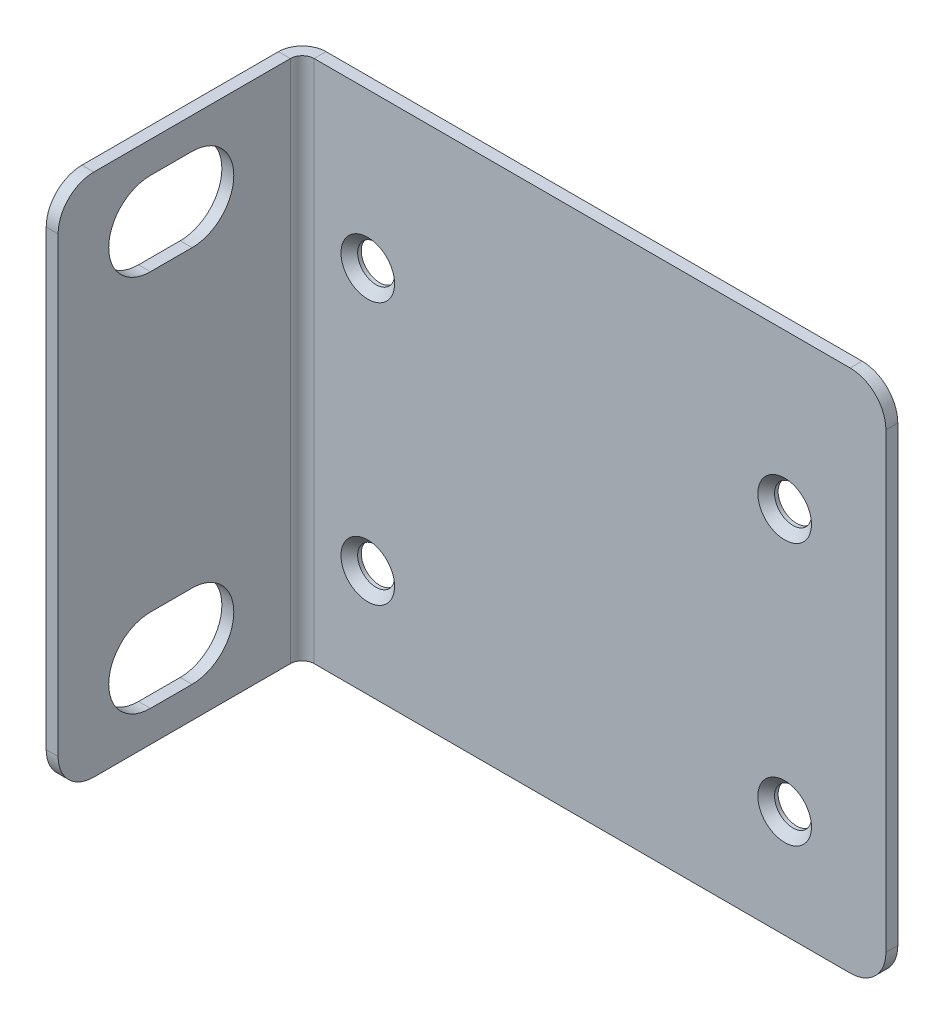
ISO-10303-21;
HEADER;
FILE_DESCRIPTION(('STEP AP214'),'2;1');
FILE_NAME('part.step','',(''),(''),'','','');
FILE_SCHEMA(('AUTOMOTIVE_DESIGN { 1 0 10303 214 1 1 1 1 }'));
ENDSEC;
DATA;
#1=APPLICATION_CONTEXT('core data for automotive mechanical design processes');
#2=APPLICATION_PROTOCOL_DEFINITION('international standard','automotive_design',2000,#1);
#3=PRODUCT_CONTEXT('',#1,'mechanical');
#4=PRODUCT('Part','Part','',(#3));
#5=PRODUCT_RELATED_PRODUCT_CATEGORY('part','',(#4));
#6=PRODUCT_DEFINITION_FORMATION('','',#4);
#7=PRODUCT_DEFINITION_CONTEXT('part definition',#1,'design');
#8=PRODUCT_DEFINITION('design','',#6,#7);
#9=PRODUCT_DEFINITION_SHAPE('','',#8);
#10=(LENGTH_UNIT() NAMED_UNIT(*) SI_UNIT(.MILLI.,.METRE.));
#11=(NAMED_UNIT(*) PLANE_ANGLE_UNIT() SI_UNIT($,.RADIAN.));
#12=(NAMED_UNIT(*) SI_UNIT($,.STERADIAN.) SOLID_ANGLE_UNIT());
#13=UNCERTAINTY_MEASURE_WITH_UNIT(LENGTH_MEASURE(1.E-05),#10,'distance_accuracy_value','');
#14=(GEOMETRIC_REPRESENTATION_CONTEXT(3) GLOBAL_UNCERTAINTY_ASSIGNED_CONTEXT((#13)) GLOBAL_UNIT_ASSIGNED_CONTEXT((#10,
#11,#12)) REPRESENTATION_CONTEXT('',''));
#15=CARTESIAN_POINT('',(0.,0.,0.));
#16=DIRECTION('',(0.,0.,1.));
#17=DIRECTION('',(1.,0.,0.));
#18=AXIS2_PLACEMENT_3D('',#15,#16,#17);
#19=CARTESIAN_POINT('',(2.,22.,0.));
#20=DIRECTION('',(0.,1.,0.));
#21=DIRECTION('',(0.,0.,1.));
#22=AXIS2_PLACEMENT_3D('',#19,#20,#21);
#23=PLANE('',#22);
#24=DIRECTION('',(0.,0.,1.));
#25=VECTOR('',#24,1.);
#26=CARTESIAN_POINT('',(2.,22.,0.));
#27=LINE('',#26,#25);
#28=CARTESIAN_POINT('',(2.,22.,0.));
#29=VERTEX_POINT('',#28);
#30=CARTESIAN_POINT('',(2.,22.,1.));
#31=VERTEX_POINT('',#30);
#32=EDGE_CURVE('E446',#29,#31,#27,.T.);
#33=ORIENTED_EDGE('',*,*,#32,.F.);
#34=CARTESIAN_POINT('',(2.,22.,2.));
#35=DIRECTION('',(0.,1.,0.));
#36=DIRECTION('',(0.,0.,1.));
#37=AXIS2_PLACEMENT_3D('',#34,#35,#36);
#38=CIRCLE('',#37,2.);
#39=CARTESIAN_POINT('',(0.,22.,2.));
#40=VERTEX_POINT('',#39);
#41=EDGE_CURVE('E390',#40,#29,#38,.F.);
#42=ORIENTED_EDGE('',*,*,#41,.F.);
#43=DIRECTION('',(-1.,0.,0.));
#44=VECTOR('',#43,1.);
#45=CARTESIAN_POINT('',(1.,22.,2.));
#46=LINE('',#45,#44);
#47=CARTESIAN_POINT('',(1.,22.,2.));
#48=VERTEX_POINT('',#47);
#49=EDGE_CURVE('E443',#48,#40,#46,.T.);
#50=ORIENTED_EDGE('',*,*,#49,.F.);
#51=CARTESIAN_POINT('',(2.,22.,2.));
#52=DIRECTION('',(0.,1.,0.));
#53=DIRECTION('',(1.,0.,0.));
#54=AXIS2_PLACEMENT_3D('',#51,#52,#53);
#55=CIRCLE('',#54,1.);
#56=EDGE_CURVE('E397',#48,#31,#55,.F.);
#57=ORIENTED_EDGE('',*,*,#56,.T.);
#58=EDGE_LOOP('',(#33,#42,#50,#57));
#59=FACE_BOUND('',#58,.T.);
#60=ADVANCED_FACE('F188',(#59),#23,.T.);
#61=CARTESIAN_POINT('',(1.,22.,2.));
#62=DIRECTION('',(0.,1.,0.));
#63=DIRECTION('',(0.,0.,1.));
#64=AXIS2_PLACEMENT_3D('',#61,#62,#63);
#65=PLANE('',#64);
#66=DIRECTION('',(1.,0.,0.));
#67=VECTOR('',#66,1.);
#68=CARTESIAN_POINT('',(0.,22.,1.));
#69=LINE('',#68,#67);
#70=CARTESIAN_POINT('',(47.,22.,1.));
#71=VERTEX_POINT('',#70);
#72=EDGE_CURVE('E383',#31,#71,#69,.T.);
#73=ORIENTED_EDGE('',*,*,#72,.T.);
#74=DIRECTION('',(0.,0.,1.));
#75=VECTOR('',#74,1.);
#76=CARTESIAN_POINT('',(47.,22.,2.));
#77=LINE('',#76,#75);
#78=CARTESIAN_POINT('',(47.,22.,0.));
#79=VERTEX_POINT('',#78);
#80=EDGE_CURVE('E457',#71,#79,#77,.F.);
#81=ORIENTED_EDGE('',*,*,#80,.T.);
#82=DIRECTION('',(1.,0.,0.));
#83=VECTOR('',#82,1.);
#84=CARTESIAN_POINT('',(0.,22.,0.));
#85=LINE('',#84,#83);
#86=EDGE_CURVE('E386',#29,#79,#85,.T.);
#87=ORIENTED_EDGE('',*,*,#86,.F.);
#88=ORIENTED_EDGE('',*,*,#32,.T.);
#89=EDGE_LOOP('',(#73,#81,#87,#88));
#90=FACE_BOUND('',#89,.T.);
#91=ADVANCED_FACE('F523',(#90),#65,.T.);
#92=CARTESIAN_POINT('',(0.,-22.,2.));
#93=DIRECTION('',(0.,-1.,0.));
#94=DIRECTION('',(0.,0.,-1.));
#95=AXIS2_PLACEMENT_3D('',#92,#93,#94);
#96=PLANE('',#95);
#97=DIRECTION('',(1.,0.,0.));
#98=VECTOR('',#97,1.);
#99=CARTESIAN_POINT('',(0.,-22.,2.));
#100=LINE('',#99,#98);
#101=CARTESIAN_POINT('',(0.,-22.,2.));
#102=VERTEX_POINT('',#101);
#103=CARTESIAN_POINT('',(1.,-22.,2.));
#104=VERTEX_POINT('',#103);
#105=EDGE_CURVE('E440',#102,#104,#100,.T.);
#106=ORIENTED_EDGE('',*,*,#105,.F.);
#107=CARTESIAN_POINT('',(2.,-22.,2.));
#108=DIRECTION('',(0.,1.,0.));
#109=DIRECTION('',(0.,0.,1.));
#110=AXIS2_PLACEMENT_3D('',#107,#108,#109);
#111=CIRCLE('',#110,2.);
#112=CARTESIAN_POINT('',(2.,-22.,0.));
#113=VERTEX_POINT('',#112);
#114=EDGE_CURVE('E406',#102,#113,#111,.F.);
#115=ORIENTED_EDGE('',*,*,#114,.T.);
#116=DIRECTION('',(0.,0.,-1.));
#117=VECTOR('',#116,1.);
#118=CARTESIAN_POINT('',(2.,-22.,1.));
#119=LINE('',#118,#117);
#120=CARTESIAN_POINT('',(2.,-22.,1.));
#121=VERTEX_POINT('',#120);
#122=EDGE_CURVE('E438',#121,#113,#119,.T.);
#123=ORIENTED_EDGE('',*,*,#122,.F.);
#124=CARTESIAN_POINT('',(2.,-22.,2.));
#125=DIRECTION('',(0.,1.,0.));
#126=DIRECTION('',(1.,0.,0.));
#127=AXIS2_PLACEMENT_3D('',#124,#125,#126);
#128=CIRCLE('',#127,1.);
#129=EDGE_CURVE('E387',#104,#121,#128,.F.);
#130=ORIENTED_EDGE('',*,*,#129,.F.);
#131=EDGE_LOOP('',(#106,#115,#123,#130));
#132=FACE_BOUND('',#131,.T.);
#133=ADVANCED_FACE('F529',(#132),#96,.T.);
#134=CARTESIAN_POINT('',(2.,-22.,1.));
#135=DIRECTION('',(0.,-1.,0.));
#136=DIRECTION('',(0.,0.,-1.));
#137=AXIS2_PLACEMENT_3D('',#134,#135,#136);
#138=PLANE('',#137);
#139=DIRECTION('',(0.,0.,-1.));
#140=VECTOR('',#139,1.);
#141=CARTESIAN_POINT('',(1.,-22.,21.5));
#142=LINE('',#141,#140);
#143=CARTESIAN_POINT('',(1.,-22.,18.5));
#144=VERTEX_POINT('',#143);
#145=EDGE_CURVE('E411',#144,#104,#142,.T.);
#146=ORIENTED_EDGE('',*,*,#145,.F.);
#147=DIRECTION('',(-1.,0.,0.));
#148=VECTOR('',#147,1.);
#149=CARTESIAN_POINT('',(2.,-22.,18.5));
#150=LINE('',#149,#148);
#151=CARTESIAN_POINT('',(0.,-22.,18.5));
#152=VERTEX_POINT('',#151);
#153=EDGE_CURVE('E466',#144,#152,#150,.T.);
#154=ORIENTED_EDGE('',*,*,#153,.T.);
#155=DIRECTION('',(0.,0.,-1.));
#156=VECTOR('',#155,1.);
#157=CARTESIAN_POINT('',(0.,-22.,21.5));
#158=LINE('',#157,#156);
#159=EDGE_CURVE('E409',#152,#102,#158,.T.);
#160=ORIENTED_EDGE('',*,*,#159,.T.);
#161=ORIENTED_EDGE('',*,*,#105,.T.);
#162=EDGE_LOOP('',(#146,#154,#160,#161));
#163=FACE_BOUND('',#162,.T.);
#164=ADVANCED_FACE('F556',(#163),#138,.T.);
#165=CARTESIAN_POINT('',(0.,22.,1.));
#166=DIRECTION('',(0.,0.,-1.));
#167=DIRECTION('',(-1.,0.,0.));
#168=AXIS2_PLACEMENT_3D('',#165,#166,#167);
#169=PLANE('',#168);
#170=CARTESIAN_POINT('',(6.49999999999972,9.00000000000059,1.));
#171=DIRECTION('',(0.,0.,1.));
#172=DIRECTION('',(1.,0.,0.));
#173=AXIS2_PLACEMENT_3D('',#170,#171,#172);
#174=CIRCLE('',#173,2.25);
#175=CARTESIAN_POINT('',(8.74999999999972,9.00000000000059,1.));
#176=VERTEX_POINT('',#175);
#177=EDGE_CURVE('E909',#176,#176,#174,.T.);
#178=ORIENTED_EDGE('',*,*,#177,.F.);
#179=EDGE_LOOP('',(#178));
#180=FACE_BOUND('',#179,.T.);
#181=CARTESIAN_POINT('',(41.4999999999997,-12.9999999999994,1.));
#182=DIRECTION('',(0.,0.,1.));
#183=DIRECTION('',(1.,0.,0.));
#184=AXIS2_PLACEMENT_3D('',#181,#182,#183);
#185=CIRCLE('',#184,2.25);
#186=CARTESIAN_POINT('',(43.7499999999997,-12.9999999999994,1.));
#187=VERTEX_POINT('',#186);
#188=EDGE_CURVE('E916',#187,#187,#185,.T.);
#189=ORIENTED_EDGE('',*,*,#188,.F.);
#190=EDGE_LOOP('',(#189));
#191=FACE_BOUND('',#190,.T.);
#192=CARTESIAN_POINT('',(6.49999999999974,-12.9999999999994,1.));
#193=DIRECTION('',(0.,0.,1.));
#194=DIRECTION('',(1.,0.,0.));
#195=AXIS2_PLACEMENT_3D('',#192,#193,#194);
#196=CIRCLE('',#195,2.25);
#197=CARTESIAN_POINT('',(8.74999999999974,-12.9999999999994,1.));
#198=VERTEX_POINT('',#197);
#199=EDGE_CURVE('E925',#198,#198,#196,.T.);
#200=ORIENTED_EDGE('',*,*,#199,.F.);
#201=EDGE_LOOP('',(#200));
#202=FACE_BOUND('',#201,.T.);
#203=CARTESIAN_POINT('',(41.4999999999997,9.00000000000058,1.));
#204=DIRECTION('',(0.,0.,1.));
#205=DIRECTION('',(1.,0.,0.));
#206=AXIS2_PLACEMENT_3D('',#203,#204,#205);
#207=CIRCLE('',#206,2.25);
#208=CARTESIAN_POINT('',(43.7499999999997,9.00000000000058,1.));
#209=VERTEX_POINT('',#208);
#210=EDGE_CURVE('E934',#209,#209,#207,.T.);
#211=ORIENTED_EDGE('',*,*,#210,.F.);
#212=EDGE_LOOP('',(#211));
#213=FACE_BOUND('',#212,.T.);
#214=DIRECTION('',(0.,-1.,0.));
#215=VECTOR('',#214,1.);
#216=CARTESIAN_POINT('',(50.,22.,1.));
#217=LINE('',#216,#215);
#218=CARTESIAN_POINT('',(50.,19.,1.));
#219=VERTEX_POINT('',#218);
#220=CARTESIAN_POINT('',(50.,-19.,1.));
#221=VERTEX_POINT('',#220);
#222=EDGE_CURVE('E435',#219,#221,#217,.T.);
#223=ORIENTED_EDGE('',*,*,#222,.F.);
#224=CARTESIAN_POINT('',(47.,19.,1.));
#225=DIRECTION('',(0.,0.,-1.));
#226=DIRECTION('',(-1.,0.,0.));
#227=AXIS2_PLACEMENT_3D('',#224,#225,#226);
#228=CIRCLE('',#227,3.);
#229=EDGE_CURVE('E455',#219,#71,#228,.F.);
#230=ORIENTED_EDGE('',*,*,#229,.T.);
#231=ORIENTED_EDGE('',*,*,#72,.F.);
#232=DIRECTION('',(0.,-1.,0.));
#233=VECTOR('',#232,1.);
#234=CARTESIAN_POINT('',(2.,22.,1.));
#235=LINE('',#234,#233);
#236=EDGE_CURVE('E400',#31,#121,#235,.T.);
#237=ORIENTED_EDGE('',*,*,#236,.T.);
#238=DIRECTION('',(1.,0.,0.));
#239=VECTOR('',#238,1.);
#240=CARTESIAN_POINT('',(0.,-22.,1.));
#241=LINE('',#240,#239);
#242=CARTESIAN_POINT('',(47.,-22.,1.));
#243=VERTEX_POINT('',#242);
#244=EDGE_CURVE('E382',#121,#243,#241,.T.);
#245=ORIENTED_EDGE('',*,*,#244,.T.);
#246=CARTESIAN_POINT('',(47.,-19.,1.));
#247=DIRECTION('',(0.,0.,-1.));
#248=DIRECTION('',(-1.,0.,0.));
#249=AXIS2_PLACEMENT_3D('',#246,#247,#248);
#250=CIRCLE('',#249,3.);
#251=EDGE_CURVE('E453',#243,#221,#250,.F.);
#252=ORIENTED_EDGE('',*,*,#251,.T.);
#253=EDGE_LOOP('',(#223,#230,#231,#237,#245,#252));
#254=FACE_BOUND('',#253,.T.);
#255=ADVANCED_FACE('F584',(#180,#191,#202,#213,#254),#169,.F.);
#256=CARTESIAN_POINT('',(50.,22.,0.));
#257=DIRECTION('',(1.,0.,0.));
#258=DIRECTION('',(0.,0.,-1.));
#259=AXIS2_PLACEMENT_3D('',#256,#257,#258);
#260=PLANE('',#259);
#261=DIRECTION('',(0.,-1.,0.));
#262=VECTOR('',#261,1.);
#263=CARTESIAN_POINT('',(50.,22.,0.));
#264=LINE('',#263,#262);
#265=CARTESIAN_POINT('',(50.,19.,0.));
#266=VERTEX_POINT('',#265);
#267=CARTESIAN_POINT('',(50.,-19.,0.));
#268=VERTEX_POINT('',#267);
#269=EDGE_CURVE('E432',#266,#268,#264,.T.);
#270=ORIENTED_EDGE('',*,*,#269,.F.);
#271=DIRECTION('',(0.,0.,1.));
#272=VECTOR('',#271,1.);
#273=CARTESIAN_POINT('',(50.,19.,0.));
#274=LINE('',#273,#272);
#275=EDGE_CURVE('E450',#266,#219,#274,.T.);
#276=ORIENTED_EDGE('',*,*,#275,.T.);
#277=ORIENTED_EDGE('',*,*,#222,.T.);
#278=DIRECTION('',(0.,0.,1.));
#279=VECTOR('',#278,1.);
#280=CARTESIAN_POINT('',(50.,-19.,0.));
#281=LINE('',#280,#279);
#282=EDGE_CURVE('E448',#221,#268,#281,.F.);
#283=ORIENTED_EDGE('',*,*,#282,.T.);
#284=EDGE_LOOP('',(#270,#276,#277,#283));
#285=FACE_BOUND('',#284,.T.);
#286=ADVANCED_FACE('F590',(#285),#260,.T.);
#287=CARTESIAN_POINT('',(0.,22.,0.));
#288=DIRECTION('',(0.,0.,-1.));
#289=DIRECTION('',(-1.,0.,0.));
#290=AXIS2_PLACEMENT_3D('',#287,#288,#289);
#291=PLANE('',#290);
#292=CARTESIAN_POINT('',(6.49999999999972,9.00000000000059,0.));
#293=DIRECTION('',(0.,0.,1.));
#294=DIRECTION('',(1.,0.,0.));
#295=AXIS2_PLACEMENT_3D('',#292,#293,#294);
#296=CIRCLE('',#295,1.55);
#297=CARTESIAN_POINT('',(8.04999999999972,9.00000000000059,0.));
#298=VERTEX_POINT('',#297);
#299=EDGE_CURVE('E911',#298,#298,#296,.T.);
#300=ORIENTED_EDGE('',*,*,#299,.T.);
#301=EDGE_LOOP('',(#300));
#302=FACE_BOUND('',#301,.T.);
#303=CARTESIAN_POINT('',(41.4999999999997,-12.9999999999994,0.));
#304=DIRECTION('',(0.,0.,1.));
#305=DIRECTION('',(1.,0.,0.));
#306=AXIS2_PLACEMENT_3D('',#303,#304,#305);
#307=CIRCLE('',#306,1.55);
#308=CARTESIAN_POINT('',(43.0499999999997,-12.9999999999994,0.));
#309=VERTEX_POINT('',#308);
#310=EDGE_CURVE('E922',#309,#309,#307,.T.);
#311=ORIENTED_EDGE('',*,*,#310,.T.);
#312=EDGE_LOOP('',(#311));
#313=FACE_BOUND('',#312,.T.);
#314=CARTESIAN_POINT('',(6.49999999999974,-12.9999999999994,0.));
#315=DIRECTION('',(0.,0.,1.));
#316=DIRECTION('',(1.,0.,0.));
#317=AXIS2_PLACEMENT_3D('',#314,#315,#316);
#318=CIRCLE('',#317,1.55);
#319=CARTESIAN_POINT('',(8.04999999999973,-12.9999999999994,0.));
#320=VERTEX_POINT('',#319);
#321=EDGE_CURVE('E931',#320,#320,#318,.T.);
#322=ORIENTED_EDGE('',*,*,#321,.T.);
#323=EDGE_LOOP('',(#322));
#324=FACE_BOUND('',#323,.T.);
#325=CARTESIAN_POINT('',(41.4999999999997,9.00000000000058,0.));
#326=DIRECTION('',(0.,0.,1.));
#327=DIRECTION('',(1.,0.,0.));
#328=AXIS2_PLACEMENT_3D('',#325,#326,#327);
#329=CIRCLE('',#328,1.55);
#330=CARTESIAN_POINT('',(43.0499999999997,9.00000000000058,0.));
#331=VERTEX_POINT('',#330);
#332=EDGE_CURVE('E348',#331,#331,#329,.T.);
#333=ORIENTED_EDGE('',*,*,#332,.T.);
#334=EDGE_LOOP('',(#333));
#335=FACE_BOUND('',#334,.T.);
#336=ORIENTED_EDGE('',*,*,#86,.T.);
#337=CARTESIAN_POINT('',(47.,19.,0.));
#338=DIRECTION('',(0.,0.,-1.));
#339=DIRECTION('',(-1.,0.,0.));
#340=AXIS2_PLACEMENT_3D('',#337,#338,#339);
#341=CIRCLE('',#340,3.);
#342=EDGE_CURVE('E461',#79,#266,#341,.T.);
#343=ORIENTED_EDGE('',*,*,#342,.T.);
#344=ORIENTED_EDGE('',*,*,#269,.T.);
#345=CARTESIAN_POINT('',(47.,-19.,0.));
#346=DIRECTION('',(0.,0.,-1.));
#347=DIRECTION('',(-1.,0.,0.));
#348=AXIS2_PLACEMENT_3D('',#345,#346,#347);
#349=CIRCLE('',#348,3.);
#350=CARTESIAN_POINT('',(47.,-22.,0.));
#351=VERTEX_POINT('',#350);
#352=EDGE_CURVE('E459',#268,#351,#349,.T.);
#353=ORIENTED_EDGE('',*,*,#352,.T.);
#354=DIRECTION('',(1.,0.,0.));
#355=VECTOR('',#354,1.);
#356=CARTESIAN_POINT('',(0.,-22.,0.));
#357=LINE('',#356,#355);
#358=EDGE_CURVE('E403',#113,#351,#357,.T.);
#359=ORIENTED_EDGE('',*,*,#358,.F.);
#360=DIRECTION('',(0.,-1.,0.));
#361=VECTOR('',#360,1.);
#362=CARTESIAN_POINT('',(2.,22.,0.));
#363=LINE('',#362,#361);
#364=EDGE_CURVE('E429',#29,#113,#363,.T.);
#365=ORIENTED_EDGE('',*,*,#364,.F.);
#366=EDGE_LOOP('',(#336,#343,#344,#353,#359,#365));
#367=FACE_BOUND('',#366,.T.);
#368=ADVANCED_FACE('F578',(#302,#313,#324,#335,#367),#291,.T.);
#369=CARTESIAN_POINT('',(2.,22.,2.));
#370=DIRECTION('',(0.,-1.,0.));
#371=DIRECTION('',(0.,0.,-1.));
#372=AXIS2_PLACEMENT_3D('',#369,#370,#371);
#373=CYLINDRICAL_SURFACE('',#372,2.);
#374=ORIENTED_EDGE('',*,*,#114,.F.);
#375=DIRECTION('',(0.,-1.,0.));
#376=VECTOR('',#375,1.);
#377=CARTESIAN_POINT('',(0.,22.,2.));
#378=LINE('',#377,#376);
#379=EDGE_CURVE('E426',#40,#102,#378,.T.);
#380=ORIENTED_EDGE('',*,*,#379,.F.);
#381=ORIENTED_EDGE('',*,*,#41,.T.);
#382=ORIENTED_EDGE('',*,*,#364,.T.);
#383=EDGE_LOOP('',(#374,#380,#381,#382));
#384=FACE_BOUND('',#383,.T.);
#385=ADVANCED_FACE('F573',(#384),#373,.T.);
#386=CARTESIAN_POINT('',(0.,22.,21.5));
#387=DIRECTION('',(-1.,0.,0.));
#388=DIRECTION('',(0.,0.,1.));
#389=AXIS2_PLACEMENT_3D('',#386,#387,#388);
#390=PLANE('',#389);
#391=CARTESIAN_POINT('',(0.,15.875,13.75));
#392=DIRECTION('',(-1.,0.,0.));
#393=DIRECTION('',(0.,0.,1.));
#394=AXIS2_PLACEMENT_3D('',#391,#392,#393);
#395=CIRCLE('',#394,3.49999999999999);
#396=CARTESIAN_POINT('',(0.,12.375,13.75));
#397=VERTEX_POINT('',#396);
#398=CARTESIAN_POINT('',(0.,19.375,13.75));
#399=VERTEX_POINT('',#398);
#400=EDGE_CURVE('E325',#397,#399,#395,.T.);
#401=ORIENTED_EDGE('',*,*,#400,.F.);
#402=DIRECTION('',(0.,0.,1.));
#403=VECTOR('',#402,1.);
#404=CARTESIAN_POINT('',(0.,12.375,10.25));
#405=LINE('',#404,#403);
#406=CARTESIAN_POINT('',(0.,12.375,10.25));
#407=VERTEX_POINT('',#406);
#408=EDGE_CURVE('E345',#407,#397,#405,.T.);
#409=ORIENTED_EDGE('',*,*,#408,.F.);
#410=CARTESIAN_POINT('',(0.,15.875,10.25));
#411=DIRECTION('',(-1.,0.,0.));
#412=DIRECTION('',(0.,0.,1.));
#413=AXIS2_PLACEMENT_3D('',#410,#411,#412);
#414=CIRCLE('',#413,3.49999999999999);
#415=CARTESIAN_POINT('',(0.,19.375,10.25));
#416=VERTEX_POINT('',#415);
#417=EDGE_CURVE('E344',#416,#407,#414,.T.);
#418=ORIENTED_EDGE('',*,*,#417,.F.);
#419=DIRECTION('',(0.,0.,1.));
#420=VECTOR('',#419,1.);
#421=CARTESIAN_POINT('',(0.,19.375,10.25));
#422=LINE('',#421,#420);
#423=EDGE_CURVE('E337',#416,#399,#422,.T.);
#424=ORIENTED_EDGE('',*,*,#423,.T.);
#425=EDGE_LOOP('',(#401,#409,#418,#424));
#426=FACE_BOUND('',#425,.T.);
#427=CARTESIAN_POINT('',(0.,-15.875,13.75));
#428=DIRECTION('',(-1.,0.,0.));
#429=DIRECTION('',(0.,0.,1.));
#430=AXIS2_PLACEMENT_3D('',#427,#428,#429);
#431=CIRCLE('',#430,3.49999999999999);
#432=CARTESIAN_POINT('',(0.,-19.3750000000001,13.75));
#433=VERTEX_POINT('',#432);
#434=CARTESIAN_POINT('',(0.,-12.375,13.75));
#435=VERTEX_POINT('',#434);
#436=EDGE_CURVE('E378',#433,#435,#431,.T.);
#437=ORIENTED_EDGE('',*,*,#436,.F.);
#438=DIRECTION('',(0.,0.,1.));
#439=VECTOR('',#438,1.);
#440=CARTESIAN_POINT('',(0.,-19.3750000000001,10.25));
#441=LINE('',#440,#439);
#442=CARTESIAN_POINT('',(0.,-19.375,10.25));
#443=VERTEX_POINT('',#442);
#444=EDGE_CURVE('E362',#443,#433,#441,.T.);
#445=ORIENTED_EDGE('',*,*,#444,.F.);
#446=CARTESIAN_POINT('',(0.,-15.875,10.25));
#447=DIRECTION('',(-1.,0.,0.));
#448=DIRECTION('',(0.,0.,1.));
#449=AXIS2_PLACEMENT_3D('',#446,#447,#448);
#450=CIRCLE('',#449,3.49999999999999);
#451=CARTESIAN_POINT('',(0.,-12.375,10.25));
#452=VERTEX_POINT('',#451);
#453=EDGE_CURVE('E370',#452,#443,#450,.T.);
#454=ORIENTED_EDGE('',*,*,#453,.F.);
#455=DIRECTION('',(0.,0.,1.));
#456=VECTOR('',#455,1.);
#457=CARTESIAN_POINT('',(0.,-12.375,10.25));
#458=LINE('',#457,#456);
#459=EDGE_CURVE('E364',#452,#435,#458,.T.);
#460=ORIENTED_EDGE('',*,*,#459,.T.);
#461=EDGE_LOOP('',(#437,#445,#454,#460));
#462=FACE_BOUND('',#461,.T.);
#463=ORIENTED_EDGE('',*,*,#159,.F.);
#464=CARTESIAN_POINT('',(0.,-19.,18.5));
#465=DIRECTION('',(-1.,0.,0.));
#466=DIRECTION('',(0.,0.,1.));
#467=AXIS2_PLACEMENT_3D('',#464,#465,#466);
#468=CIRCLE('',#467,3.);
#469=CARTESIAN_POINT('',(0.,-19.,21.5));
#470=VERTEX_POINT('',#469);
#471=EDGE_CURVE('E471',#152,#470,#468,.T.);
#472=ORIENTED_EDGE('',*,*,#471,.T.);
#473=DIRECTION('',(0.,-1.,0.));
#474=VECTOR('',#473,1.);
#475=CARTESIAN_POINT('',(0.,22.,21.5));
#476=LINE('',#475,#474);
#477=CARTESIAN_POINT('',(0.,19.,21.5));
#478=VERTEX_POINT('',#477);
#479=EDGE_CURVE('E423',#478,#470,#476,.T.);
#480=ORIENTED_EDGE('',*,*,#479,.F.);
#481=CARTESIAN_POINT('',(0.,19.,18.5));
#482=DIRECTION('',(-1.,0.,0.));
#483=DIRECTION('',(0.,0.,1.));
#484=AXIS2_PLACEMENT_3D('',#481,#482,#483);
#485=CIRCLE('',#484,3.);
#486=CARTESIAN_POINT('',(0.,22.,18.5));
#487=VERTEX_POINT('',#486);
#488=EDGE_CURVE('E469',#478,#487,#485,.T.);
#489=ORIENTED_EDGE('',*,*,#488,.T.);
#490=DIRECTION('',(0.,0.,-1.));
#491=VECTOR('',#490,1.);
#492=CARTESIAN_POINT('',(0.,22.,21.5));
#493=LINE('',#492,#491);
#494=EDGE_CURVE('E393',#487,#40,#493,.T.);
#495=ORIENTED_EDGE('',*,*,#494,.T.);
#496=ORIENTED_EDGE('',*,*,#379,.T.);
#497=EDGE_LOOP('',(#463,#472,#480,#489,#495,#496));
#498=FACE_BOUND('',#497,.T.);
#499=ADVANCED_FACE('F342',(#426,#462,#498),#390,.T.);
#500=CARTESIAN_POINT('',(1.,22.,21.5));
#501=DIRECTION('',(0.,0.,1.));
#502=DIRECTION('',(1.,0.,0.));
#503=AXIS2_PLACEMENT_3D('',#500,#501,#502);
#504=PLANE('',#503);
#505=ORIENTED_EDGE('',*,*,#479,.T.);
#506=DIRECTION('',(-1.,0.,0.));
#507=VECTOR('',#506,1.);
#508=CARTESIAN_POINT('',(1.,-19.,21.5));
#509=LINE('',#508,#507);
#510=CARTESIAN_POINT('',(1.,-19.,21.5));
#511=VERTEX_POINT('',#510);
#512=EDGE_CURVE('E476',#470,#511,#509,.F.);
#513=ORIENTED_EDGE('',*,*,#512,.T.);
#514=DIRECTION('',(0.,-1.,0.));
#515=VECTOR('',#514,1.);
#516=CARTESIAN_POINT('',(1.,22.,21.5));
#517=LINE('',#516,#515);
#518=CARTESIAN_POINT('',(1.,19.,21.5));
#519=VERTEX_POINT('',#518);
#520=EDGE_CURVE('E420',#519,#511,#517,.T.);
#521=ORIENTED_EDGE('',*,*,#520,.F.);
#522=DIRECTION('',(-1.,0.,0.));
#523=VECTOR('',#522,1.);
#524=CARTESIAN_POINT('',(1.,19.,21.5));
#525=LINE('',#524,#523);
#526=EDGE_CURVE('E473',#519,#478,#525,.T.);
#527=ORIENTED_EDGE('',*,*,#526,.T.);
#528=EDGE_LOOP('',(#505,#513,#521,#527));
#529=FACE_BOUND('',#528,.T.);
#530=ADVANCED_FACE('F774',(#529),#504,.T.);
#531=CARTESIAN_POINT('',(1.,22.,21.5));
#532=DIRECTION('',(-1.,0.,0.));
#533=DIRECTION('',(0.,0.,1.));
#534=AXIS2_PLACEMENT_3D('',#531,#532,#533);
#535=PLANE('',#534);
#536=DIRECTION('',(0.,0.,1.));
#537=VECTOR('',#536,1.);
#538=CARTESIAN_POINT('',(1.,12.375,21.5));
#539=LINE('',#538,#537);
#540=CARTESIAN_POINT('',(1.,12.375,10.25));
#541=VERTEX_POINT('',#540);
#542=CARTESIAN_POINT('',(1.,12.375,13.75));
#543=VERTEX_POINT('',#542);
#544=EDGE_CURVE('E358',#541,#543,#539,.T.);
#545=ORIENTED_EDGE('',*,*,#544,.T.);
#546=CARTESIAN_POINT('',(1.,15.875,13.75));
#547=DIRECTION('',(-1.,0.,0.));
#548=DIRECTION('',(0.,0.,1.));
#549=AXIS2_PLACEMENT_3D('',#546,#547,#548);
#550=CIRCLE('',#549,3.49999999999999);
#551=CARTESIAN_POINT('',(1.,19.375,13.75));
#552=VERTEX_POINT('',#551);
#553=EDGE_CURVE('E13',#543,#552,#550,.T.);
#554=ORIENTED_EDGE('',*,*,#553,.T.);
#555=DIRECTION('',(0.,0.,1.));
#556=VECTOR('',#555,1.);
#557=CARTESIAN_POINT('',(1.,19.375,21.5));
#558=LINE('',#557,#556);
#559=CARTESIAN_POINT('',(1.,19.375,10.25));
#560=VERTEX_POINT('',#559);
#561=EDGE_CURVE('E340',#560,#552,#558,.T.);
#562=ORIENTED_EDGE('',*,*,#561,.F.);
#563=CARTESIAN_POINT('',(1.,15.875,10.25));
#564=DIRECTION('',(-1.,0.,0.));
#565=DIRECTION('',(0.,0.,1.));
#566=AXIS2_PLACEMENT_3D('',#563,#564,#565);
#567=CIRCLE('',#566,3.49999999999999);
#568=EDGE_CURVE('E355',#560,#541,#567,.T.);
#569=ORIENTED_EDGE('',*,*,#568,.T.);
#570=EDGE_LOOP('',(#545,#554,#562,#569));
#571=FACE_BOUND('',#570,.T.);
#572=DIRECTION('',(0.,0.,1.));
#573=VECTOR('',#572,1.);
#574=CARTESIAN_POINT('',(1.,-19.375,21.5));
#575=LINE('',#574,#573);
#576=CARTESIAN_POINT('',(1.,-19.375,10.25));
#577=VERTEX_POINT('',#576);
#578=CARTESIAN_POINT('',(1.,-19.375,13.75));
#579=VERTEX_POINT('',#578);
#580=EDGE_CURVE('E484',#577,#579,#575,.T.);
#581=ORIENTED_EDGE('',*,*,#580,.T.);
#582=CARTESIAN_POINT('',(1.,-15.875,13.75));
#583=DIRECTION('',(-1.,0.,0.));
#584=DIRECTION('',(0.,0.,1.));
#585=AXIS2_PLACEMENT_3D('',#582,#583,#584);
#586=CIRCLE('',#585,3.49999999999999);
#587=CARTESIAN_POINT('',(1.,-12.375,13.75));
#588=VERTEX_POINT('',#587);
#589=EDGE_CURVE('E196',#579,#588,#586,.T.);
#590=ORIENTED_EDGE('',*,*,#589,.T.);
#591=DIRECTION('',(0.,0.,1.));
#592=VECTOR('',#591,1.);
#593=CARTESIAN_POINT('',(1.,-12.375,21.5));
#594=LINE('',#593,#592);
#595=CARTESIAN_POINT('',(1.,-12.375,10.25));
#596=VERTEX_POINT('',#595);
#597=EDGE_CURVE('E490',#596,#588,#594,.T.);
#598=ORIENTED_EDGE('',*,*,#597,.F.);
#599=CARTESIAN_POINT('',(1.,-15.875,10.25));
#600=DIRECTION('',(-1.,0.,0.));
#601=DIRECTION('',(0.,0.,1.));
#602=AXIS2_PLACEMENT_3D('',#599,#600,#601);
#603=CIRCLE('',#602,3.49999999999999);
#604=EDGE_CURVE('E487',#596,#577,#603,.T.);
#605=ORIENTED_EDGE('',*,*,#604,.T.);
#606=EDGE_LOOP('',(#581,#590,#598,#605));
#607=FACE_BOUND('',#606,.T.);
#608=ORIENTED_EDGE('',*,*,#520,.T.);
#609=CARTESIAN_POINT('',(1.,-19.,18.5));
#610=DIRECTION('',(-1.,0.,0.));
#611=DIRECTION('',(0.,0.,1.));
#612=AXIS2_PLACEMENT_3D('',#609,#610,#611);
#613=CIRCLE('',#612,3.);
#614=EDGE_CURVE('E480',#511,#144,#613,.F.);
#615=ORIENTED_EDGE('',*,*,#614,.T.);
#616=ORIENTED_EDGE('',*,*,#145,.T.);
#617=DIRECTION('',(0.,-1.,0.));
#618=VECTOR('',#617,1.);
#619=CARTESIAN_POINT('',(1.,22.,2.));
#620=LINE('',#619,#618);
#621=EDGE_CURVE('E417',#48,#104,#620,.T.);
#622=ORIENTED_EDGE('',*,*,#621,.F.);
#623=DIRECTION('',(0.,0.,-1.));
#624=VECTOR('',#623,1.);
#625=CARTESIAN_POINT('',(1.,22.,21.5));
#626=LINE('',#625,#624);
#627=CARTESIAN_POINT('',(1.,22.,18.5));
#628=VERTEX_POINT('',#627);
#629=EDGE_CURVE('E395',#628,#48,#626,.T.);
#630=ORIENTED_EDGE('',*,*,#629,.F.);
#631=CARTESIAN_POINT('',(1.,19.,18.5));
#632=DIRECTION('',(-1.,0.,0.));
#633=DIRECTION('',(0.,0.,1.));
#634=AXIS2_PLACEMENT_3D('',#631,#632,#633);
#635=CIRCLE('',#634,3.);
#636=EDGE_CURVE('E478',#628,#519,#635,.F.);
#637=ORIENTED_EDGE('',*,*,#636,.T.);
#638=EDGE_LOOP('',(#608,#615,#616,#622,#630,#637));
#639=FACE_BOUND('',#638,.T.);
#640=ADVANCED_FACE('F495',(#571,#607,#639),#535,.F.);
#641=CARTESIAN_POINT('',(2.,22.,2.));
#642=DIRECTION('',(0.,-1.,0.));
#643=DIRECTION('',(0.,0.,-1.));
#644=AXIS2_PLACEMENT_3D('',#641,#642,#643);
#645=CYLINDRICAL_SURFACE('',#644,1.);
#646=ORIENTED_EDGE('',*,*,#129,.T.);
#647=ORIENTED_EDGE('',*,*,#236,.F.);
#648=ORIENTED_EDGE('',*,*,#56,.F.);
#649=ORIENTED_EDGE('',*,*,#621,.T.);
#650=EDGE_LOOP('',(#646,#647,#648,#649));
#651=FACE_BOUND('',#650,.T.);
#652=ADVANCED_FACE('F563',(#651),#645,.F.);
#653=CARTESIAN_POINT('',(2.,22.,2.));
#654=DIRECTION('',(0.,1.,0.));
#655=DIRECTION('',(1.,0.,0.));
#656=AXIS2_PLACEMENT_3D('',#653,#654,#655);
#657=PLANE('',#656);
#658=ORIENTED_EDGE('',*,*,#494,.F.);
#659=DIRECTION('',(-1.,0.,0.));
#660=VECTOR('',#659,1.);
#661=CARTESIAN_POINT('',(2.,22.,18.5));
#662=LINE('',#661,#660);
#663=EDGE_CURVE('E482',#487,#628,#662,.F.);
#664=ORIENTED_EDGE('',*,*,#663,.T.);
#665=ORIENTED_EDGE('',*,*,#629,.T.);
#666=ORIENTED_EDGE('',*,*,#49,.T.);
#667=EDGE_LOOP('',(#658,#664,#665,#666));
#668=FACE_BOUND('',#667,.T.);
#669=ADVANCED_FACE('F812',(#668),#657,.T.);
#670=CARTESIAN_POINT('',(2.,-22.,2.));
#671=DIRECTION('',(0.,1.,0.));
#672=DIRECTION('',(1.,0.,0.));
#673=AXIS2_PLACEMENT_3D('',#670,#671,#672);
#674=PLANE('',#673);
#675=ORIENTED_EDGE('',*,*,#358,.T.);
#676=DIRECTION('',(0.,0.,1.));
#677=VECTOR('',#676,1.);
#678=CARTESIAN_POINT('',(47.,-22.,1.));
#679=LINE('',#678,#677);
#680=EDGE_CURVE('E463',#351,#243,#679,.T.);
#681=ORIENTED_EDGE('',*,*,#680,.T.);
#682=ORIENTED_EDGE('',*,*,#244,.F.);
#683=ORIENTED_EDGE('',*,*,#122,.T.);
#684=EDGE_LOOP('',(#675,#681,#682,#683));
#685=FACE_BOUND('',#684,.T.);
#686=ADVANCED_FACE('F538',(#685),#674,.F.);
#687=CARTESIAN_POINT('',(47.,19.,0.));
#688=DIRECTION('',(0.,0.,1.));
#689=DIRECTION('',(1.,0.,0.));
#690=AXIS2_PLACEMENT_3D('',#687,#688,#689);
#691=CYLINDRICAL_SURFACE('',#690,3.);
#692=ORIENTED_EDGE('',*,*,#342,.F.);
#693=ORIENTED_EDGE('',*,*,#80,.F.);
#694=ORIENTED_EDGE('',*,*,#229,.F.);
#695=ORIENTED_EDGE('',*,*,#275,.F.);
#696=EDGE_LOOP('',(#692,#693,#694,#695));
#697=FACE_BOUND('',#696,.T.);
#698=ADVANCED_FACE('F534',(#697),#691,.T.);
#699=CARTESIAN_POINT('',(47.,-19.,2.));
#700=DIRECTION('',(0.,0.,-1.));
#701=DIRECTION('',(-1.,0.,0.));
#702=AXIS2_PLACEMENT_3D('',#699,#700,#701);
#703=CYLINDRICAL_SURFACE('',#702,3.);
#704=ORIENTED_EDGE('',*,*,#352,.F.);
#705=ORIENTED_EDGE('',*,*,#282,.F.);
#706=ORIENTED_EDGE('',*,*,#251,.F.);
#707=ORIENTED_EDGE('',*,*,#680,.F.);
#708=EDGE_LOOP('',(#704,#705,#706,#707));
#709=FACE_BOUND('',#708,.T.);
#710=ADVANCED_FACE('F537',(#709),#703,.T.);
#711=CARTESIAN_POINT('',(2.,-19.,18.5));
#712=DIRECTION('',(-1.,0.,0.));
#713=DIRECTION('',(0.,0.,1.));
#714=AXIS2_PLACEMENT_3D('',#711,#712,#713);
#715=CYLINDRICAL_SURFACE('',#714,3.);
#716=ORIENTED_EDGE('',*,*,#614,.F.);
#717=ORIENTED_EDGE('',*,*,#512,.F.);
#718=ORIENTED_EDGE('',*,*,#471,.F.);
#719=ORIENTED_EDGE('',*,*,#153,.F.);
#720=EDGE_LOOP('',(#716,#717,#718,#719));
#721=FACE_BOUND('',#720,.T.);
#722=ADVANCED_FACE('F541',(#721),#715,.T.);
#723=CARTESIAN_POINT('',(1.,19.,18.5));
#724=DIRECTION('',(-1.,0.,0.));
#725=DIRECTION('',(0.,0.,1.));
#726=AXIS2_PLACEMENT_3D('',#723,#724,#725);
#727=CYLINDRICAL_SURFACE('',#726,3.);
#728=ORIENTED_EDGE('',*,*,#636,.F.);
#729=ORIENTED_EDGE('',*,*,#663,.F.);
#730=ORIENTED_EDGE('',*,*,#488,.F.);
#731=ORIENTED_EDGE('',*,*,#526,.F.);
#732=EDGE_LOOP('',(#728,#729,#730,#731));
#733=FACE_BOUND('',#732,.T.);
#734=ADVANCED_FACE('F190',(#733),#727,.T.);
#735=CARTESIAN_POINT('',(50.,-12.375,10.25));
#736=DIRECTION('',(0.,-1.,0.));
#737=DIRECTION('',(1.,0.,0.));
#738=AXIS2_PLACEMENT_3D('',#735,#736,#737);
#739=PLANE('',#738);
#740=ORIENTED_EDGE('',*,*,#597,.T.);
#741=DIRECTION('',(1.,0.,0.));
#742=VECTOR('',#741,1.);
#743=CARTESIAN_POINT('',(50.,-12.375,13.75));
#744=LINE('',#743,#742);
#745=EDGE_CURVE('E375',#435,#588,#744,.T.);
#746=ORIENTED_EDGE('',*,*,#745,.F.);
#747=ORIENTED_EDGE('',*,*,#459,.F.);
#748=DIRECTION('',(1.,0.,0.));
#749=VECTOR('',#748,1.);
#750=CARTESIAN_POINT('',(50.,-12.375,10.25));
#751=LINE('',#750,#749);
#752=EDGE_CURVE('E367',#452,#596,#751,.T.);
#753=ORIENTED_EDGE('',*,*,#752,.T.);
#754=EDGE_LOOP('',(#740,#746,#747,#753));
#755=FACE_BOUND('',#754,.T.);
#756=ADVANCED_FACE('F504',(#755),#739,.T.);
#757=CARTESIAN_POINT('',(0.,-15.875,13.75));
#758=DIRECTION('',(-1.,0.,0.));
#759=DIRECTION('',(0.,0.,1.));
#760=AXIS2_PLACEMENT_3D('',#757,#758,#759);
#761=CYLINDRICAL_SURFACE('',#760,3.49999999999999);
#762=DIRECTION('',(-1.,0.,0.));
#763=VECTOR('',#762,1.);
#764=CARTESIAN_POINT('',(0.,-19.375,13.75));
#765=LINE('',#764,#763);
#766=EDGE_CURVE('E380',#433,#579,#765,.F.);
#767=ORIENTED_EDGE('',*,*,#766,.F.);
#768=ORIENTED_EDGE('',*,*,#436,.T.);
#769=ORIENTED_EDGE('',*,*,#745,.T.);
#770=ORIENTED_EDGE('',*,*,#589,.F.);
#771=EDGE_LOOP('',(#767,#768,#769,#770));
#772=FACE_BOUND('',#771,.T.);
#773=ADVANCED_FACE('F499',(#772),#761,.F.);
#774=CARTESIAN_POINT('',(0.,-15.875,10.25));
#775=DIRECTION('',(-1.,0.,0.));
#776=DIRECTION('',(0.,0.,1.));
#777=AXIS2_PLACEMENT_3D('',#774,#775,#776);
#778=CYLINDRICAL_SURFACE('',#777,3.49999999999999);
#779=ORIENTED_EDGE('',*,*,#752,.F.);
#780=ORIENTED_EDGE('',*,*,#453,.T.);
#781=DIRECTION('',(-1.,0.,0.));
#782=VECTOR('',#781,1.);
#783=CARTESIAN_POINT('',(0.,-19.375,10.25));
#784=LINE('',#783,#782);
#785=EDGE_CURVE('E373',#577,#443,#784,.T.);
#786=ORIENTED_EDGE('',*,*,#785,.F.);
#787=ORIENTED_EDGE('',*,*,#604,.F.);
#788=EDGE_LOOP('',(#779,#780,#786,#787));
#789=FACE_BOUND('',#788,.T.);
#790=ADVANCED_FACE('F510',(#789),#778,.F.);
#791=CARTESIAN_POINT('',(0.,-19.375,10.25));
#792=DIRECTION('',(0.,-1.,0.));
#793=DIRECTION('',(0.,0.,-1.));
#794=AXIS2_PLACEMENT_3D('',#791,#792,#793);
#795=PLANE('',#794);
#796=ORIENTED_EDGE('',*,*,#785,.T.);
#797=ORIENTED_EDGE('',*,*,#444,.T.);
#798=ORIENTED_EDGE('',*,*,#766,.T.);
#799=ORIENTED_EDGE('',*,*,#580,.F.);
#800=EDGE_LOOP('',(#796,#797,#798,#799));
#801=FACE_BOUND('',#800,.T.);
#802=ADVANCED_FACE('F512',(#801),#795,.F.);
#803=CARTESIAN_POINT('',(0.,15.875,13.75));
#804=DIRECTION('',(-1.,0.,0.));
#805=DIRECTION('',(0.,0.,1.));
#806=AXIS2_PLACEMENT_3D('',#803,#804,#805);
#807=CYLINDRICAL_SURFACE('',#806,3.49999999999999);
#808=DIRECTION('',(-1.,0.,0.));
#809=VECTOR('',#808,1.);
#810=CARTESIAN_POINT('',(0.,12.375,13.75));
#811=LINE('',#810,#809);
#812=EDGE_CURVE('E330',#397,#543,#811,.F.);
#813=ORIENTED_EDGE('',*,*,#812,.F.);
#814=ORIENTED_EDGE('',*,*,#400,.T.);
#815=DIRECTION('',(1.,0.,0.));
#816=VECTOR('',#815,1.);
#817=CARTESIAN_POINT('',(50.,19.375,13.75));
#818=LINE('',#817,#816);
#819=EDGE_CURVE('E328',#399,#552,#818,.T.);
#820=ORIENTED_EDGE('',*,*,#819,.T.);
#821=ORIENTED_EDGE('',*,*,#553,.F.);
#822=EDGE_LOOP('',(#813,#814,#820,#821));
#823=FACE_BOUND('',#822,.T.);
#824=ADVANCED_FACE('F327',(#823),#807,.F.);
#825=CARTESIAN_POINT('',(50.,19.375,10.25));
#826=DIRECTION('',(0.,-1.,0.));
#827=DIRECTION('',(1.,0.,0.));
#828=AXIS2_PLACEMENT_3D('',#825,#826,#827);
#829=PLANE('',#828);
#830=ORIENTED_EDGE('',*,*,#561,.T.);
#831=ORIENTED_EDGE('',*,*,#819,.F.);
#832=ORIENTED_EDGE('',*,*,#423,.F.);
#833=DIRECTION('',(1.,0.,0.));
#834=VECTOR('',#833,1.);
#835=CARTESIAN_POINT('',(50.,19.375,10.25));
#836=LINE('',#835,#834);
#837=EDGE_CURVE('E208',#416,#560,#836,.T.);
#838=ORIENTED_EDGE('',*,*,#837,.T.);
#839=EDGE_LOOP('',(#830,#831,#832,#838));
#840=FACE_BOUND('',#839,.T.);
#841=ADVANCED_FACE('F336',(#840),#829,.T.);
#842=CARTESIAN_POINT('',(0.,12.375,10.25));
#843=DIRECTION('',(0.,-1.,0.));
#844=DIRECTION('',(0.,0.,-1.));
#845=AXIS2_PLACEMENT_3D('',#842,#843,#844);
#846=PLANE('',#845);
#847=DIRECTION('',(-1.,0.,0.));
#848=VECTOR('',#847,1.);
#849=CARTESIAN_POINT('',(0.,12.375,10.25));
#850=LINE('',#849,#848);
#851=EDGE_CURVE('E203',#541,#407,#850,.T.);
#852=ORIENTED_EDGE('',*,*,#851,.T.);
#853=ORIENTED_EDGE('',*,*,#408,.T.);
#854=ORIENTED_EDGE('',*,*,#812,.T.);
#855=ORIENTED_EDGE('',*,*,#544,.F.);
#856=EDGE_LOOP('',(#852,#853,#854,#855));
#857=FACE_BOUND('',#856,.T.);
#858=ADVANCED_FACE('F723',(#857),#846,.F.);
#859=CARTESIAN_POINT('',(0.,15.875,10.25));
#860=DIRECTION('',(-1.,0.,0.));
#861=DIRECTION('',(0.,0.,1.));
#862=AXIS2_PLACEMENT_3D('',#859,#860,#861);
#863=CYLINDRICAL_SURFACE('',#862,3.49999999999999);
#864=ORIENTED_EDGE('',*,*,#837,.F.);
#865=ORIENTED_EDGE('',*,*,#417,.T.);
#866=ORIENTED_EDGE('',*,*,#851,.F.);
#867=ORIENTED_EDGE('',*,*,#568,.F.);
#868=EDGE_LOOP('',(#864,#865,#866,#867));
#869=FACE_BOUND('',#868,.T.);
#870=ADVANCED_FACE('F626',(#869),#863,.F.);
#871=CARTESIAN_POINT('',(41.4999999999997,9.00000000000058,1.));
#872=DIRECTION('',(0.,0.,1.));
#873=DIRECTION('',(1.,0.,0.));
#874=AXIS2_PLACEMENT_3D('',#871,#872,#873);
#875=CYLINDRICAL_SURFACE('',#874,1.55);
#876=ORIENTED_EDGE('',*,*,#332,.F.);
#877=EDGE_LOOP('',(#876));
#878=FACE_BOUND('',#877,.T.);
#879=CARTESIAN_POINT('',(41.4999999999997,9.00000000000058,0.300000000000001));
#880=DIRECTION('',(0.,0.,1.));
#881=DIRECTION('',(1.,0.,0.));
#882=AXIS2_PLACEMENT_3D('',#879,#880,#881);
#883=CIRCLE('',#882,1.55);
#884=CARTESIAN_POINT('',(43.0499999999997,9.00000000000058,0.300000000000001));
#885=VERTEX_POINT('',#884);
#886=EDGE_CURVE('E937',#885,#885,#883,.T.);
#887=ORIENTED_EDGE('',*,*,#886,.T.);
#888=EDGE_LOOP('',(#887));
#889=FACE_BOUND('',#888,.T.);
#890=ADVANCED_FACE('F636',(#878,#889),#875,.F.);
#891=CARTESIAN_POINT('',(41.4999999999997,9.00000000000058,1.));
#892=DIRECTION('',(0.,0.,1.));
#893=DIRECTION('',(1.,0.,0.));
#894=AXIS2_PLACEMENT_3D('',#891,#892,#893);
#895=CONICAL_SURFACE('',#894,2.25,0.785398163397449);
#896=ORIENTED_EDGE('',*,*,#886,.F.);
#897=EDGE_LOOP('',(#896));
#898=FACE_BOUND('',#897,.T.);
#899=ORIENTED_EDGE('',*,*,#210,.T.);
#900=EDGE_LOOP('',(#899));
#901=FACE_BOUND('',#900,.T.);
#902=ADVANCED_FACE('F642',(#898,#901),#895,.F.);
#903=CARTESIAN_POINT('',(6.49999999999974,-12.9999999999994,1.));
#904=DIRECTION('',(0.,0.,1.));
#905=DIRECTION('',(1.,0.,0.));
#906=AXIS2_PLACEMENT_3D('',#903,#904,#905);
#907=CYLINDRICAL_SURFACE('',#906,1.55);
#908=ORIENTED_EDGE('',*,*,#321,.F.);
#909=EDGE_LOOP('',(#908));
#910=FACE_BOUND('',#909,.T.);
#911=CARTESIAN_POINT('',(6.49999999999974,-12.9999999999994,0.300000000000001));
#912=DIRECTION('',(0.,0.,1.));
#913=DIRECTION('',(1.,0.,0.));
#914=AXIS2_PLACEMENT_3D('',#911,#912,#913);
#915=CIRCLE('',#914,1.55);
#916=CARTESIAN_POINT('',(8.04999999999973,-12.9999999999994,0.300000000000001));
#917=VERTEX_POINT('',#916);
#918=EDGE_CURVE('E928',#917,#917,#915,.T.);
#919=ORIENTED_EDGE('',*,*,#918,.T.);
#920=EDGE_LOOP('',(#919));
#921=FACE_BOUND('',#920,.T.);
#922=ADVANCED_FACE('F653',(#910,#921),#907,.F.);
#923=CARTESIAN_POINT('',(6.49999999999974,-12.9999999999994,1.));
#924=DIRECTION('',(0.,0.,1.));
#925=DIRECTION('',(1.,0.,0.));
#926=AXIS2_PLACEMENT_3D('',#923,#924,#925);
#927=CONICAL_SURFACE('',#926,2.25,0.78539816339745);
#928=ORIENTED_EDGE('',*,*,#918,.F.);
#929=EDGE_LOOP('',(#928));
#930=FACE_BOUND('',#929,.T.);
#931=ORIENTED_EDGE('',*,*,#199,.T.);
#932=EDGE_LOOP('',(#931));
#933=FACE_BOUND('',#932,.T.);
#934=ADVANCED_FACE('F663',(#930,#933),#927,.F.);
#935=CARTESIAN_POINT('',(41.4999999999997,-12.9999999999994,1.));
#936=DIRECTION('',(0.,0.,1.));
#937=DIRECTION('',(1.,0.,0.));
#938=AXIS2_PLACEMENT_3D('',#935,#936,#937);
#939=CYLINDRICAL_SURFACE('',#938,1.55);
#940=ORIENTED_EDGE('',*,*,#310,.F.);
#941=EDGE_LOOP('',(#940));
#942=FACE_BOUND('',#941,.T.);
#943=CARTESIAN_POINT('',(41.4999999999997,-12.9999999999994,0.300000000000001));
#944=DIRECTION('',(0.,0.,1.));
#945=DIRECTION('',(1.,0.,0.));
#946=AXIS2_PLACEMENT_3D('',#943,#944,#945);
#947=CIRCLE('',#946,1.55);
#948=CARTESIAN_POINT('',(43.0499999999997,-12.9999999999994,0.300000000000001));
#949=VERTEX_POINT('',#948);
#950=EDGE_CURVE('E919',#949,#949,#947,.T.);
#951=ORIENTED_EDGE('',*,*,#950,.T.);
#952=EDGE_LOOP('',(#951));
#953=FACE_BOUND('',#952,.T.);
#954=ADVANCED_FACE('F674',(#942,#953),#939,.F.);
#955=CARTESIAN_POINT('',(41.4999999999997,-12.9999999999994,1.));
#956=DIRECTION('',(0.,0.,1.));
#957=DIRECTION('',(1.,0.,0.));
#958=AXIS2_PLACEMENT_3D('',#955,#956,#957);
#959=CONICAL_SURFACE('',#958,2.25,0.785398163397449);
#960=ORIENTED_EDGE('',*,*,#950,.F.);
#961=EDGE_LOOP('',(#960));
#962=FACE_BOUND('',#961,.T.);
#963=ORIENTED_EDGE('',*,*,#188,.T.);
#964=EDGE_LOOP('',(#963));
#965=FACE_BOUND('',#964,.T.);
#966=ADVANCED_FACE('F684',(#962,#965),#959,.F.);
#967=CARTESIAN_POINT('',(6.49999999999972,9.00000000000059,1.));
#968=DIRECTION('',(0.,0.,1.));
#969=DIRECTION('',(1.,0.,0.));
#970=AXIS2_PLACEMENT_3D('',#967,#968,#969);
#971=CYLINDRICAL_SURFACE('',#970,1.55);
#972=ORIENTED_EDGE('',*,*,#299,.F.);
#973=EDGE_LOOP('',(#972));
#974=FACE_BOUND('',#973,.T.);
#975=CARTESIAN_POINT('',(6.49999999999972,9.00000000000059,0.300000000000001));
#976=DIRECTION('',(0.,0.,1.));
#977=DIRECTION('',(1.,0.,0.));
#978=AXIS2_PLACEMENT_3D('',#975,#976,#977);
#979=CIRCLE('',#978,1.55);
#980=CARTESIAN_POINT('',(8.04999999999972,9.00000000000059,0.300000000000001));
#981=VERTEX_POINT('',#980);
#982=EDGE_CURVE('E906',#981,#981,#979,.T.);
#983=ORIENTED_EDGE('',*,*,#982,.T.);
#984=EDGE_LOOP('',(#983));
#985=FACE_BOUND('',#984,.T.);
#986=ADVANCED_FACE('F695',(#974,#985),#971,.F.);
#987=CARTESIAN_POINT('',(6.49999999999972,9.00000000000059,1.));
#988=DIRECTION('',(0.,0.,1.));
#989=DIRECTION('',(1.,0.,0.));
#990=AXIS2_PLACEMENT_3D('',#987,#988,#989);
#991=CONICAL_SURFACE('',#990,2.25,0.78539816339745);
#992=ORIENTED_EDGE('',*,*,#982,.F.);
#993=EDGE_LOOP('',(#992));
#994=FACE_BOUND('',#993,.T.);
#995=ORIENTED_EDGE('',*,*,#177,.T.);
#996=EDGE_LOOP('',(#995));
#997=FACE_BOUND('',#996,.T.);
#998=ADVANCED_FACE('F705',(#994,#997),#991,.F.);
#999=CLOSED_SHELL('',(#60,#91,#133,#164,#255,#286,#368,#385,#499,#530,#640,#652,#669,#686,#698,
#710,#722,#734,#756,#773,#790,#802,#824,#841,#858,#870,#890,#902,#922,#934,#954,#966,#986,#998));
#1000=MANIFOLD_SOLID_BREP('B2',#999);
#1001=ADVANCED_BREP_SHAPE_REPRESENTATION('',(#18,#1000),#14);
#1002=SHAPE_DEFINITION_REPRESENTATION(#9,#1001);
ENDSEC;
END-ISO-10303-21;
